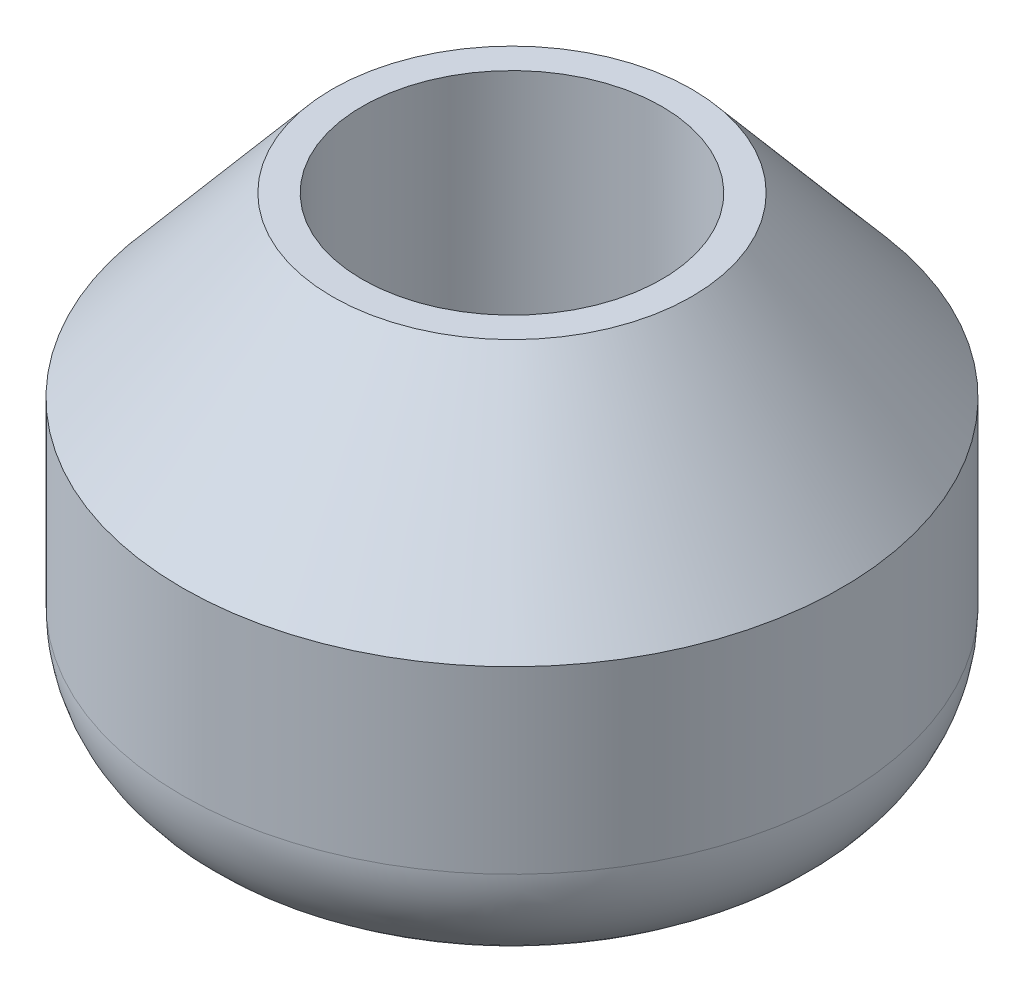
ISO-10303-21;
HEADER;
FILE_DESCRIPTION(('STEP AP214'),'2;1');
FILE_NAME('part.step','',(''),(''),'','','');
FILE_SCHEMA(('AUTOMOTIVE_DESIGN { 1 0 10303 214 1 1 1 1 }'));
ENDSEC;
DATA;
#1=APPLICATION_CONTEXT('core data for automotive mechanical design processes');
#2=APPLICATION_PROTOCOL_DEFINITION('international standard','automotive_design',2000,#1);
#3=PRODUCT_CONTEXT('',#1,'mechanical');
#4=PRODUCT('Part','Part','',(#3));
#5=PRODUCT_RELATED_PRODUCT_CATEGORY('part','',(#4));
#6=PRODUCT_DEFINITION_FORMATION('','',#4);
#7=PRODUCT_DEFINITION_CONTEXT('part definition',#1,'design');
#8=PRODUCT_DEFINITION('design','',#6,#7);
#9=PRODUCT_DEFINITION_SHAPE('','',#8);
#10=(LENGTH_UNIT() NAMED_UNIT(*) SI_UNIT(.MILLI.,.METRE.));
#11=(NAMED_UNIT(*) PLANE_ANGLE_UNIT() SI_UNIT($,.RADIAN.));
#12=(NAMED_UNIT(*) SI_UNIT($,.STERADIAN.) SOLID_ANGLE_UNIT());
#13=UNCERTAINTY_MEASURE_WITH_UNIT(LENGTH_MEASURE(1.E-05),#10,'distance_accuracy_value','');
#14=(GEOMETRIC_REPRESENTATION_CONTEXT(3) GLOBAL_UNCERTAINTY_ASSIGNED_CONTEXT((#13)) GLOBAL_UNIT_ASSIGNED_CONTEXT((#10,
#11,#12)) REPRESENTATION_CONTEXT('',''));
#15=CARTESIAN_POINT('',(0.,0.,0.));
#16=DIRECTION('',(0.,0.,1.));
#17=DIRECTION('',(1.,0.,0.));
#18=AXIS2_PLACEMENT_3D('',#15,#16,#17);
#19=CARTESIAN_POINT('',(7.,0.,0.));
#20=DIRECTION('',(0.,-1.,0.));
#21=DIRECTION('',(0.,0.,-1.));
#22=AXIS2_PLACEMENT_3D('',#19,#20,#21);
#23=PLANE('',#22);
#24=CARTESIAN_POINT('',(0.,0.,0.));
#25=DIRECTION('',(0.,-1.,0.));
#26=DIRECTION('',(0.,0.,-1.));
#27=AXIS2_PLACEMENT_3D('',#24,#25,#26);
#28=CIRCLE('',#27,7.);
#29=CARTESIAN_POINT('',(0.,0.,-7.));
#30=VERTEX_POINT('',#29);
#31=EDGE_CURVE('E57',#30,#30,#28,.T.);
#32=ORIENTED_EDGE('',*,*,#31,.T.);
#33=EDGE_LOOP('',(#32));
#34=FACE_BOUND('',#33,.T.);
#35=CARTESIAN_POINT('',(0.,0.,0.));
#36=DIRECTION('',(0.,-1.,0.));
#37=DIRECTION('',(0.,0.,-1.));
#38=AXIS2_PLACEMENT_3D('',#35,#36,#37);
#39=CIRCLE('',#38,5.);
#40=CARTESIAN_POINT('',(0.,0.,-5.));
#41=VERTEX_POINT('',#40);
#42=EDGE_CURVE('E10',#41,#41,#39,.T.);
#43=ORIENTED_EDGE('',*,*,#42,.F.);
#44=EDGE_LOOP('',(#43));
#45=FACE_BOUND('',#44,.T.);
#46=ADVANCED_FACE('F35',(#34,#45),#23,.T.);
#47=CARTESIAN_POINT('',(0.,0.,0.));
#48=DIRECTION('',(0.,-1.,0.));
#49=DIRECTION('',(0.,0.,-1.));
#50=AXIS2_PLACEMENT_3D('',#47,#48,#49);
#51=CYLINDRICAL_SURFACE('',#50,5.);
#52=ORIENTED_EDGE('',*,*,#42,.T.);
#53=EDGE_LOOP('',(#52));
#54=FACE_BOUND('',#53,.T.);
#55=CARTESIAN_POINT('',(0.,15.92,0.));
#56=DIRECTION('',(0.,-1.,0.));
#57=DIRECTION('',(0.,0.,-1.));
#58=AXIS2_PLACEMENT_3D('',#55,#56,#57);
#59=CIRCLE('',#58,5.);
#60=CARTESIAN_POINT('',(0.,15.92,-5.));
#61=VERTEX_POINT('',#60);
#62=EDGE_CURVE('E41',#61,#61,#59,.T.);
#63=ORIENTED_EDGE('',*,*,#62,.F.);
#64=EDGE_LOOP('',(#63));
#65=FACE_BOUND('',#64,.T.);
#66=ADVANCED_FACE('F75',(#54,#65),#51,.F.);
#67=CARTESIAN_POINT('',(5.,15.92,0.));
#68=DIRECTION('',(0.,1.,0.));
#69=DIRECTION('',(0.,0.,1.));
#70=AXIS2_PLACEMENT_3D('',#67,#68,#69);
#71=PLANE('',#70);
#72=ORIENTED_EDGE('',*,*,#62,.T.);
#73=EDGE_LOOP('',(#72));
#74=FACE_BOUND('',#73,.T.);
#75=CARTESIAN_POINT('',(0.,15.92,0.));
#76=DIRECTION('',(0.,-1.,0.));
#77=DIRECTION('',(0.,0.,-1.));
#78=AXIS2_PLACEMENT_3D('',#75,#76,#77);
#79=CIRCLE('',#78,6.);
#80=CARTESIAN_POINT('',(0.,15.92,-6.));
#81=VERTEX_POINT('',#80);
#82=EDGE_CURVE('E45',#81,#81,#79,.T.);
#83=ORIENTED_EDGE('',*,*,#82,.F.);
#84=EDGE_LOOP('',(#83));
#85=FACE_BOUND('',#84,.T.);
#86=ADVANCED_FACE('F79',(#74,#85),#71,.T.);
#87=CARTESIAN_POINT('',(0.,10.,0.));
#88=DIRECTION('',(0.,-1.,0.));
#89=DIRECTION('',(0.,0.,-1.));
#90=AXIS2_PLACEMENT_3D('',#87,#88,#89);
#91=CONICAL_SURFACE('',#90,11.,0.701347565284984);
#92=ORIENTED_EDGE('',*,*,#82,.T.);
#93=EDGE_LOOP('',(#92));
#94=FACE_BOUND('',#93,.T.);
#95=CARTESIAN_POINT('',(0.,10.,0.));
#96=DIRECTION('',(0.,-1.,0.));
#97=DIRECTION('',(0.,0.,-1.));
#98=AXIS2_PLACEMENT_3D('',#95,#96,#97);
#99=CIRCLE('',#98,11.);
#100=CARTESIAN_POINT('',(0.,10.,-11.));
#101=VERTEX_POINT('',#100);
#102=EDGE_CURVE('E49',#101,#101,#99,.T.);
#103=ORIENTED_EDGE('',*,*,#102,.F.);
#104=EDGE_LOOP('',(#103));
#105=FACE_BOUND('',#104,.T.);
#106=ADVANCED_FACE('F71',(#94,#105),#91,.T.);
#107=CARTESIAN_POINT('',(0.,0.,0.));
#108=DIRECTION('',(0.,-1.,0.));
#109=DIRECTION('',(0.,0.,-1.));
#110=AXIS2_PLACEMENT_3D('',#107,#108,#109);
#111=CYLINDRICAL_SURFACE('',#110,11.);
#112=ORIENTED_EDGE('',*,*,#102,.T.);
#113=EDGE_LOOP('',(#112));
#114=FACE_BOUND('',#113,.T.);
#115=CARTESIAN_POINT('',(0.,4.,0.));
#116=DIRECTION('',(0.,-1.,0.));
#117=DIRECTION('',(0.,0.,-1.));
#118=AXIS2_PLACEMENT_3D('',#115,#116,#117);
#119=CIRCLE('',#118,11.);
#120=CARTESIAN_POINT('',(0.,4.,-11.));
#121=VERTEX_POINT('',#120);
#122=EDGE_CURVE('E54',#121,#121,#119,.T.);
#123=ORIENTED_EDGE('',*,*,#122,.F.);
#124=EDGE_LOOP('',(#123));
#125=FACE_BOUND('',#124,.T.);
#126=ADVANCED_FACE('F65',(#114,#125),#111,.T.);
#127=CARTESIAN_POINT('',(0.,4.,0.));
#128=DIRECTION('',(0.,-1.,0.));
#129=DIRECTION('',(0.,0.,-1.));
#130=AXIS2_PLACEMENT_3D('',#127,#128,#129);
#131=TOROIDAL_SURFACE('',#130,7.,4.);
#132=ORIENTED_EDGE('',*,*,#122,.T.);
#133=EDGE_LOOP('',(#132));
#134=FACE_BOUND('',#133,.T.);
#135=ORIENTED_EDGE('',*,*,#31,.F.);
#136=EDGE_LOOP('',(#135));
#137=FACE_BOUND('',#136,.T.);
#138=ADVANCED_FACE('F63',(#134,#137),#131,.T.);
#139=CLOSED_SHELL('',(#46,#66,#86,#106,#126,#138));
#140=MANIFOLD_SOLID_BREP('B2',#139);
#141=ADVANCED_BREP_SHAPE_REPRESENTATION('',(#18,#140),#14);
#142=SHAPE_DEFINITION_REPRESENTATION(#9,#141);
ENDSEC;
END-ISO-10303-21;
